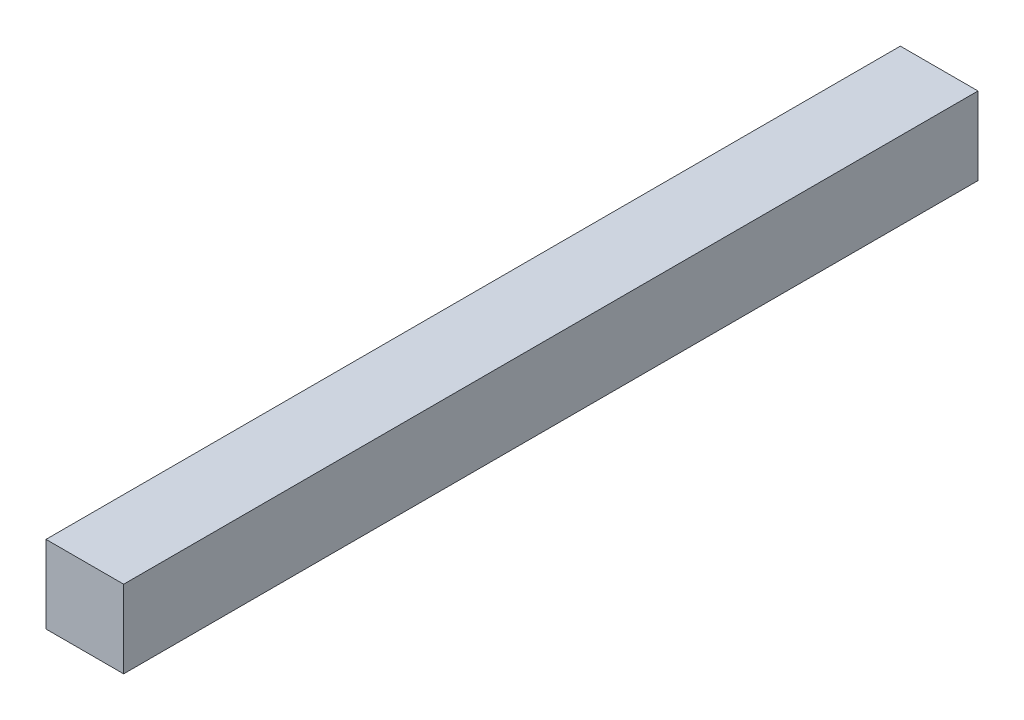
ISO-10303-21;
HEADER;
FILE_DESCRIPTION(('STEP AP214'),'2;1');
FILE_NAME('part.step','',(''),(''),'','','');
FILE_SCHEMA(('AUTOMOTIVE_DESIGN { 1 0 10303 214 1 1 1 1 }'));
ENDSEC;
DATA;
#1=APPLICATION_CONTEXT('core data for automotive mechanical design processes');
#2=APPLICATION_PROTOCOL_DEFINITION('international standard','automotive_design',2000,#1);
#3=PRODUCT_CONTEXT('',#1,'mechanical');
#4=PRODUCT('Part','Part','',(#3));
#5=PRODUCT_RELATED_PRODUCT_CATEGORY('part','',(#4));
#6=PRODUCT_DEFINITION_FORMATION('','',#4);
#7=PRODUCT_DEFINITION_CONTEXT('part definition',#1,'design');
#8=PRODUCT_DEFINITION('design','',#6,#7);
#9=PRODUCT_DEFINITION_SHAPE('','',#8);
#10=(LENGTH_UNIT() NAMED_UNIT(*) SI_UNIT(.MILLI.,.METRE.));
#11=(NAMED_UNIT(*) PLANE_ANGLE_UNIT() SI_UNIT($,.RADIAN.));
#12=(NAMED_UNIT(*) SI_UNIT($,.STERADIAN.) SOLID_ANGLE_UNIT());
#13=UNCERTAINTY_MEASURE_WITH_UNIT(LENGTH_MEASURE(1.E-05),#10,'distance_accuracy_value','');
#14=(GEOMETRIC_REPRESENTATION_CONTEXT(3) GLOBAL_UNCERTAINTY_ASSIGNED_CONTEXT((#13)) GLOBAL_UNIT_ASSIGNED_CONTEXT((#10,
#11,#12)) REPRESENTATION_CONTEXT('',''));
#15=CARTESIAN_POINT('',(0.,0.,0.));
#16=DIRECTION('',(0.,0.,1.));
#17=DIRECTION('',(1.,0.,0.));
#18=AXIS2_PLACEMENT_3D('',#15,#16,#17);
#19=CARTESIAN_POINT('',(0.,0.,27.94));
#20=DIRECTION('',(-1.,0.,0.));
#21=DIRECTION('',(0.,-1.,0.));
#22=AXIS2_PLACEMENT_3D('',#19,#20,#21);
#23=PLANE('',#22);
#24=DIRECTION('',(0.,1.,0.));
#25=VECTOR('',#24,1.);
#26=CARTESIAN_POINT('',(0.,0.,0.));
#27=LINE('',#26,#25);
#28=CARTESIAN_POINT('',(0.,0.,0.));
#29=VERTEX_POINT('',#28);
#30=CARTESIAN_POINT('',(0.,2.54,0.));
#31=VERTEX_POINT('',#30);
#32=EDGE_CURVE('E107',#29,#31,#27,.T.);
#33=ORIENTED_EDGE('',*,*,#32,.T.);
#34=DIRECTION('',(0.,0.,-1.));
#35=VECTOR('',#34,1.);
#36=CARTESIAN_POINT('',(0.,2.54,27.94));
#37=LINE('',#36,#35);
#38=CARTESIAN_POINT('',(0.,2.54,27.94));
#39=VERTEX_POINT('',#38);
#40=EDGE_CURVE('E11',#39,#31,#37,.T.);
#41=ORIENTED_EDGE('',*,*,#40,.F.);
#42=DIRECTION('',(0.,1.,0.));
#43=VECTOR('',#42,1.);
#44=CARTESIAN_POINT('',(0.,0.,27.94));
#45=LINE('',#44,#43);
#46=CARTESIAN_POINT('',(0.,0.,27.94));
#47=VERTEX_POINT('',#46);
#48=EDGE_CURVE('E91',#47,#39,#45,.T.);
#49=ORIENTED_EDGE('',*,*,#48,.F.);
#50=DIRECTION('',(0.,0.,-1.));
#51=VECTOR('',#50,1.);
#52=CARTESIAN_POINT('',(0.,0.,27.94));
#53=LINE('',#52,#51);
#54=EDGE_CURVE('E103',#47,#29,#53,.T.);
#55=ORIENTED_EDGE('',*,*,#54,.T.);
#56=EDGE_LOOP('',(#33,#41,#49,#55));
#57=FACE_BOUND('',#56,.T.);
#58=ADVANCED_FACE('F39',(#57),#23,.F.);
#59=CARTESIAN_POINT('',(0.,2.54,27.94));
#60=DIRECTION('',(0.,-1.,0.));
#61=DIRECTION('',(1.,0.,0.));
#62=AXIS2_PLACEMENT_3D('',#59,#60,#61);
#63=PLANE('',#62);
#64=DIRECTION('',(-1.,0.,0.));
#65=VECTOR('',#64,1.);
#66=CARTESIAN_POINT('',(0.,2.54,0.));
#67=LINE('',#66,#65);
#68=CARTESIAN_POINT('',(-2.54,2.54,0.));
#69=VERTEX_POINT('',#68);
#70=EDGE_CURVE('E96',#31,#69,#67,.T.);
#71=ORIENTED_EDGE('',*,*,#70,.T.);
#72=DIRECTION('',(0.,0.,-1.));
#73=VECTOR('',#72,1.);
#74=CARTESIAN_POINT('',(-2.54,2.54,27.94));
#75=LINE('',#74,#73);
#76=CARTESIAN_POINT('',(-2.54,2.54,27.94));
#77=VERTEX_POINT('',#76);
#78=EDGE_CURVE('E48',#77,#69,#75,.T.);
#79=ORIENTED_EDGE('',*,*,#78,.F.);
#80=DIRECTION('',(-1.,0.,0.));
#81=VECTOR('',#80,1.);
#82=CARTESIAN_POINT('',(0.,2.54,27.94));
#83=LINE('',#82,#81);
#84=EDGE_CURVE('E86',#39,#77,#83,.T.);
#85=ORIENTED_EDGE('',*,*,#84,.F.);
#86=ORIENTED_EDGE('',*,*,#40,.T.);
#87=EDGE_LOOP('',(#71,#79,#85,#86));
#88=FACE_BOUND('',#87,.T.);
#89=ADVANCED_FACE('F95',(#88),#63,.F.);
#90=CARTESIAN_POINT('',(-2.54,0.,27.94));
#91=DIRECTION('',(1.,0.,0.));
#92=DIRECTION('',(0.,0.,-1.));
#93=AXIS2_PLACEMENT_3D('',#90,#91,#92);
#94=PLANE('',#93);
#95=DIRECTION('',(0.,-1.,0.));
#96=VECTOR('',#95,1.);
#97=CARTESIAN_POINT('',(-2.54,0.,0.));
#98=LINE('',#97,#96);
#99=CARTESIAN_POINT('',(-2.54,0.,0.));
#100=VERTEX_POINT('',#99);
#101=EDGE_CURVE('E73',#69,#100,#98,.T.);
#102=ORIENTED_EDGE('',*,*,#101,.T.);
#103=DIRECTION('',(0.,0.,-1.));
#104=VECTOR('',#103,1.);
#105=CARTESIAN_POINT('',(-2.54,0.,27.94));
#106=LINE('',#105,#104);
#107=CARTESIAN_POINT('',(-2.54,0.,27.94));
#108=VERTEX_POINT('',#107);
#109=EDGE_CURVE('E98',#108,#100,#106,.T.);
#110=ORIENTED_EDGE('',*,*,#109,.F.);
#111=DIRECTION('',(0.,-1.,0.));
#112=VECTOR('',#111,1.);
#113=CARTESIAN_POINT('',(-2.54,0.,27.94));
#114=LINE('',#113,#112);
#115=EDGE_CURVE('E89',#77,#108,#114,.T.);
#116=ORIENTED_EDGE('',*,*,#115,.F.);
#117=ORIENTED_EDGE('',*,*,#78,.T.);
#118=EDGE_LOOP('',(#102,#110,#116,#117));
#119=FACE_BOUND('',#118,.T.);
#120=ADVANCED_FACE('F99',(#119),#94,.F.);
#121=CARTESIAN_POINT('',(0.,0.,27.94));
#122=DIRECTION('',(0.,1.,0.));
#123=DIRECTION('',(0.,0.,1.));
#124=AXIS2_PLACEMENT_3D('',#121,#122,#123);
#125=PLANE('',#124);
#126=DIRECTION('',(1.,0.,0.));
#127=VECTOR('',#126,1.);
#128=CARTESIAN_POINT('',(0.,0.,0.));
#129=LINE('',#128,#127);
#130=EDGE_CURVE('E79',#100,#29,#129,.T.);
#131=ORIENTED_EDGE('',*,*,#130,.T.);
#132=ORIENTED_EDGE('',*,*,#54,.F.);
#133=DIRECTION('',(1.,0.,0.));
#134=VECTOR('',#133,1.);
#135=CARTESIAN_POINT('',(0.,0.,27.94));
#136=LINE('',#135,#134);
#137=EDGE_CURVE('E56',#108,#47,#136,.T.);
#138=ORIENTED_EDGE('',*,*,#137,.F.);
#139=ORIENTED_EDGE('',*,*,#109,.T.);
#140=EDGE_LOOP('',(#131,#132,#138,#139));
#141=FACE_BOUND('',#140,.T.);
#142=ADVANCED_FACE('F120',(#141),#125,.F.);
#143=CARTESIAN_POINT('',(0.,0.,27.94));
#144=DIRECTION('',(0.,0.,1.));
#145=DIRECTION('',(1.,0.,0.));
#146=AXIS2_PLACEMENT_3D('',#143,#144,#145);
#147=PLANE('',#146);
#148=ORIENTED_EDGE('',*,*,#48,.T.);
#149=ORIENTED_EDGE('',*,*,#84,.T.);
#150=ORIENTED_EDGE('',*,*,#115,.T.);
#151=ORIENTED_EDGE('',*,*,#137,.T.);
#152=EDGE_LOOP('',(#148,#149,#150,#151));
#153=FACE_BOUND('',#152,.T.);
#154=ADVANCED_FACE('F87',(#153),#147,.T.);
#155=CARTESIAN_POINT('',(0.,0.,0.));
#156=DIRECTION('',(0.,0.,1.));
#157=DIRECTION('',(1.,0.,0.));
#158=AXIS2_PLACEMENT_3D('',#155,#156,#157);
#159=PLANE('',#158);
#160=ORIENTED_EDGE('',*,*,#32,.F.);
#161=ORIENTED_EDGE('',*,*,#130,.F.);
#162=ORIENTED_EDGE('',*,*,#101,.F.);
#163=ORIENTED_EDGE('',*,*,#70,.F.);
#164=EDGE_LOOP('',(#160,#161,#162,#163));
#165=FACE_BOUND('',#164,.T.);
#166=ADVANCED_FACE('F123',(#165),#159,.F.);
#167=CLOSED_SHELL('',(#58,#89,#120,#142,#154,#166));
#168=MANIFOLD_SOLID_BREP('B2',#167);
#169=ADVANCED_BREP_SHAPE_REPRESENTATION('',(#18,#168),#14);
#170=SHAPE_DEFINITION_REPRESENTATION(#9,#169);
ENDSEC;
END-ISO-10303-21;
